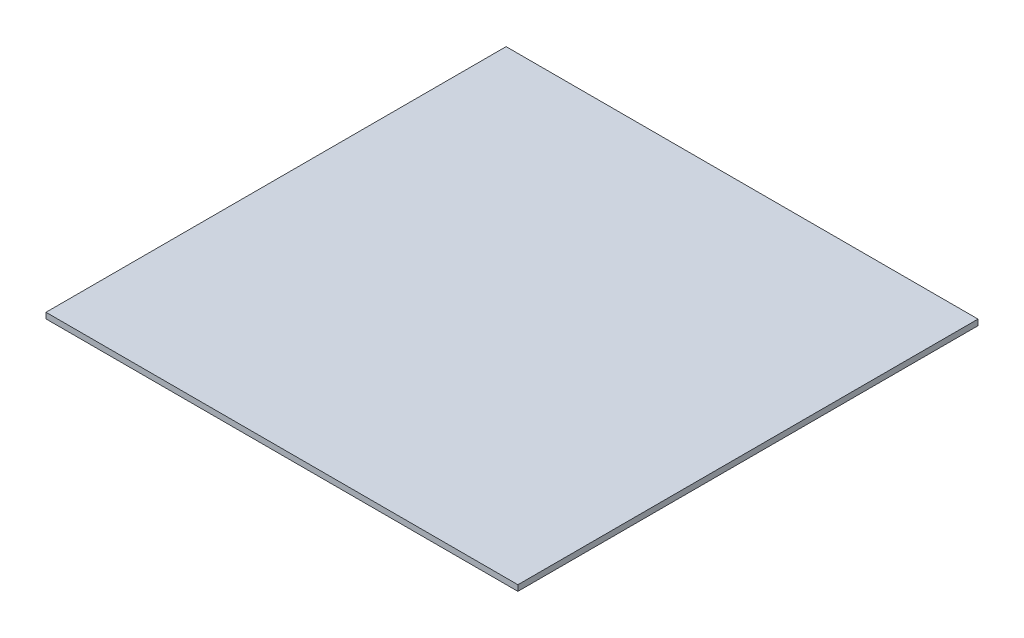
ISO-10303-21;
HEADER;
FILE_DESCRIPTION(('STEP AP214'),'2;1');
FILE_NAME('part.step','',(''),(''),'','','');
FILE_SCHEMA(('AUTOMOTIVE_DESIGN { 1 0 10303 214 1 1 1 1 }'));
ENDSEC;
DATA;
#1=APPLICATION_CONTEXT('core data for automotive mechanical design processes');
#2=APPLICATION_PROTOCOL_DEFINITION('international standard','automotive_design',2000,#1);
#3=PRODUCT_CONTEXT('',#1,'mechanical');
#4=PRODUCT('Part','Part','',(#3));
#5=PRODUCT_RELATED_PRODUCT_CATEGORY('part','',(#4));
#6=PRODUCT_DEFINITION_FORMATION('','',#4);
#7=PRODUCT_DEFINITION_CONTEXT('part definition',#1,'design');
#8=PRODUCT_DEFINITION('design','',#6,#7);
#9=PRODUCT_DEFINITION_SHAPE('','',#8);
#10=(LENGTH_UNIT() NAMED_UNIT(*) SI_UNIT(.MILLI.,.METRE.));
#11=(NAMED_UNIT(*) PLANE_ANGLE_UNIT() SI_UNIT($,.RADIAN.));
#12=(NAMED_UNIT(*) SI_UNIT($,.STERADIAN.) SOLID_ANGLE_UNIT());
#13=UNCERTAINTY_MEASURE_WITH_UNIT(LENGTH_MEASURE(1.E-05),#10,'distance_accuracy_value','');
#14=(GEOMETRIC_REPRESENTATION_CONTEXT(3) GLOBAL_UNCERTAINTY_ASSIGNED_CONTEXT((#13)) GLOBAL_UNIT_ASSIGNED_CONTEXT((#10,
#11,#12)) REPRESENTATION_CONTEXT('',''));
#15=CARTESIAN_POINT('',(0.,0.,0.));
#16=DIRECTION('',(0.,0.,1.));
#17=DIRECTION('',(1.,0.,0.));
#18=AXIS2_PLACEMENT_3D('',#15,#16,#17);
#19=CARTESIAN_POINT('',(-200.,-4.9,0.));
#20=DIRECTION('',(-1.,0.,0.));
#21=DIRECTION('',(0.,0.,1.));
#22=AXIS2_PLACEMENT_3D('',#19,#20,#21);
#23=PLANE('',#22);
#24=DIRECTION('',(0.,0.,1.));
#25=VECTOR('',#24,1.);
#26=CARTESIAN_POINT('',(-200.,0.,0.));
#27=LINE('',#26,#25);
#28=CARTESIAN_POINT('',(-200.,0.,-390.));
#29=VERTEX_POINT('',#28);
#30=CARTESIAN_POINT('',(-200.,0.,0.));
#31=VERTEX_POINT('',#30);
#32=EDGE_CURVE('E105',#29,#31,#27,.T.);
#33=ORIENTED_EDGE('',*,*,#32,.F.);
#34=DIRECTION('',(0.,1.,0.));
#35=VECTOR('',#34,1.);
#36=CARTESIAN_POINT('',(-200.,-4.9,-390.));
#37=LINE('',#36,#35);
#38=CARTESIAN_POINT('',(-200.,-4.9,-390.));
#39=VERTEX_POINT('',#38);
#40=EDGE_CURVE('E11',#39,#29,#37,.T.);
#41=ORIENTED_EDGE('',*,*,#40,.F.);
#42=DIRECTION('',(0.,0.,1.));
#43=VECTOR('',#42,1.);
#44=CARTESIAN_POINT('',(-200.,-4.9,0.));
#45=LINE('',#44,#43);
#46=CARTESIAN_POINT('',(-200.,-4.9,0.));
#47=VERTEX_POINT('',#46);
#48=EDGE_CURVE('E99',#39,#47,#45,.T.);
#49=ORIENTED_EDGE('',*,*,#48,.T.);
#50=DIRECTION('',(0.,1.,0.));
#51=VECTOR('',#50,1.);
#52=CARTESIAN_POINT('',(-200.,-4.9,0.));
#53=LINE('',#52,#51);
#54=EDGE_CURVE('E44',#47,#31,#53,.T.);
#55=ORIENTED_EDGE('',*,*,#54,.T.);
#56=EDGE_LOOP('',(#33,#41,#49,#55));
#57=FACE_BOUND('',#56,.T.);
#58=ADVANCED_FACE('F41',(#57),#23,.T.);
#59=CARTESIAN_POINT('',(-200.,-4.9,-390.));
#60=DIRECTION('',(0.,0.,-1.));
#61=DIRECTION('',(-1.,0.,0.));
#62=AXIS2_PLACEMENT_3D('',#59,#60,#61);
#63=PLANE('',#62);
#64=DIRECTION('',(-1.,0.,0.));
#65=VECTOR('',#64,1.);
#66=CARTESIAN_POINT('',(-200.,0.,-390.));
#67=LINE('',#66,#65);
#68=CARTESIAN_POINT('',(200.,0.,-390.));
#69=VERTEX_POINT('',#68);
#70=EDGE_CURVE('E101',#69,#29,#67,.T.);
#71=ORIENTED_EDGE('',*,*,#70,.F.);
#72=DIRECTION('',(0.,1.,0.));
#73=VECTOR('',#72,1.);
#74=CARTESIAN_POINT('',(200.,-4.9,-390.));
#75=LINE('',#74,#73);
#76=CARTESIAN_POINT('',(200.,-4.9,-390.));
#77=VERTEX_POINT('',#76);
#78=EDGE_CURVE('E50',#77,#69,#75,.T.);
#79=ORIENTED_EDGE('',*,*,#78,.F.);
#80=DIRECTION('',(-1.,0.,0.));
#81=VECTOR('',#80,1.);
#82=CARTESIAN_POINT('',(-200.,-4.9,-390.));
#83=LINE('',#82,#81);
#84=EDGE_CURVE('E96',#77,#39,#83,.T.);
#85=ORIENTED_EDGE('',*,*,#84,.T.);
#86=ORIENTED_EDGE('',*,*,#40,.T.);
#87=EDGE_LOOP('',(#71,#79,#85,#86));
#88=FACE_BOUND('',#87,.T.);
#89=ADVANCED_FACE('F115',(#88),#63,.T.);
#90=CARTESIAN_POINT('',(200.,-4.9,0.));
#91=DIRECTION('',(1.,0.,0.));
#92=DIRECTION('',(0.,0.,-1.));
#93=AXIS2_PLACEMENT_3D('',#90,#91,#92);
#94=PLANE('',#93);
#95=DIRECTION('',(0.,0.,-1.));
#96=VECTOR('',#95,1.);
#97=CARTESIAN_POINT('',(200.,0.,0.));
#98=LINE('',#97,#96);
#99=CARTESIAN_POINT('',(200.,0.,0.));
#100=VERTEX_POINT('',#99);
#101=EDGE_CURVE('E91',#100,#69,#98,.T.);
#102=ORIENTED_EDGE('',*,*,#101,.F.);
#103=DIRECTION('',(0.,1.,0.));
#104=VECTOR('',#103,1.);
#105=CARTESIAN_POINT('',(200.,-4.9,0.));
#106=LINE('',#105,#104);
#107=CARTESIAN_POINT('',(200.,-4.9,0.));
#108=VERTEX_POINT('',#107);
#109=EDGE_CURVE('E86',#108,#100,#106,.T.);
#110=ORIENTED_EDGE('',*,*,#109,.F.);
#111=DIRECTION('',(0.,0.,-1.));
#112=VECTOR('',#111,1.);
#113=CARTESIAN_POINT('',(200.,-4.9,0.));
#114=LINE('',#113,#112);
#115=EDGE_CURVE('E89',#108,#77,#114,.T.);
#116=ORIENTED_EDGE('',*,*,#115,.T.);
#117=ORIENTED_EDGE('',*,*,#78,.T.);
#118=EDGE_LOOP('',(#102,#110,#116,#117));
#119=FACE_BOUND('',#118,.T.);
#120=ADVANCED_FACE('F88',(#119),#94,.T.);
#121=CARTESIAN_POINT('',(-200.,-4.9,0.));
#122=DIRECTION('',(0.,0.,1.));
#123=DIRECTION('',(1.,0.,0.));
#124=AXIS2_PLACEMENT_3D('',#121,#122,#123);
#125=PLANE('',#124);
#126=DIRECTION('',(1.,0.,0.));
#127=VECTOR('',#126,1.);
#128=CARTESIAN_POINT('',(-200.,0.,0.));
#129=LINE('',#128,#127);
#130=EDGE_CURVE('E108',#31,#100,#129,.T.);
#131=ORIENTED_EDGE('',*,*,#130,.F.);
#132=ORIENTED_EDGE('',*,*,#54,.F.);
#133=DIRECTION('',(1.,0.,0.));
#134=VECTOR('',#133,1.);
#135=CARTESIAN_POINT('',(-200.,-4.9,0.));
#136=LINE('',#135,#134);
#137=EDGE_CURVE('E95',#47,#108,#136,.T.);
#138=ORIENTED_EDGE('',*,*,#137,.T.);
#139=ORIENTED_EDGE('',*,*,#109,.T.);
#140=EDGE_LOOP('',(#131,#132,#138,#139));
#141=FACE_BOUND('',#140,.T.);
#142=ADVANCED_FACE('F98',(#141),#125,.T.);
#143=CARTESIAN_POINT('',(0.,-4.9,0.));
#144=DIRECTION('',(0.,-1.,0.));
#145=DIRECTION('',(0.,0.,-1.));
#146=AXIS2_PLACEMENT_3D('',#143,#144,#145);
#147=PLANE('',#146);
#148=ORIENTED_EDGE('',*,*,#48,.F.);
#149=ORIENTED_EDGE('',*,*,#84,.F.);
#150=ORIENTED_EDGE('',*,*,#115,.F.);
#151=ORIENTED_EDGE('',*,*,#137,.F.);
#152=EDGE_LOOP('',(#148,#149,#150,#151));
#153=FACE_BOUND('',#152,.T.);
#154=ADVANCED_FACE('F94',(#153),#147,.T.);
#155=CARTESIAN_POINT('',(0.,0.,0.));
#156=DIRECTION('',(0.,-1.,0.));
#157=DIRECTION('',(0.,0.,-1.));
#158=AXIS2_PLACEMENT_3D('',#155,#156,#157);
#159=PLANE('',#158);
#160=ORIENTED_EDGE('',*,*,#32,.T.);
#161=ORIENTED_EDGE('',*,*,#130,.T.);
#162=ORIENTED_EDGE('',*,*,#101,.T.);
#163=ORIENTED_EDGE('',*,*,#70,.T.);
#164=EDGE_LOOP('',(#160,#161,#162,#163));
#165=FACE_BOUND('',#164,.T.);
#166=ADVANCED_FACE('F114',(#165),#159,.F.);
#167=CLOSED_SHELL('',(#58,#89,#120,#142,#154,#166));
#168=MANIFOLD_SOLID_BREP('B2',#167);
#169=ADVANCED_BREP_SHAPE_REPRESENTATION('',(#18,#168),#14);
#170=SHAPE_DEFINITION_REPRESENTATION(#9,#169);
ENDSEC;
END-ISO-10303-21;
